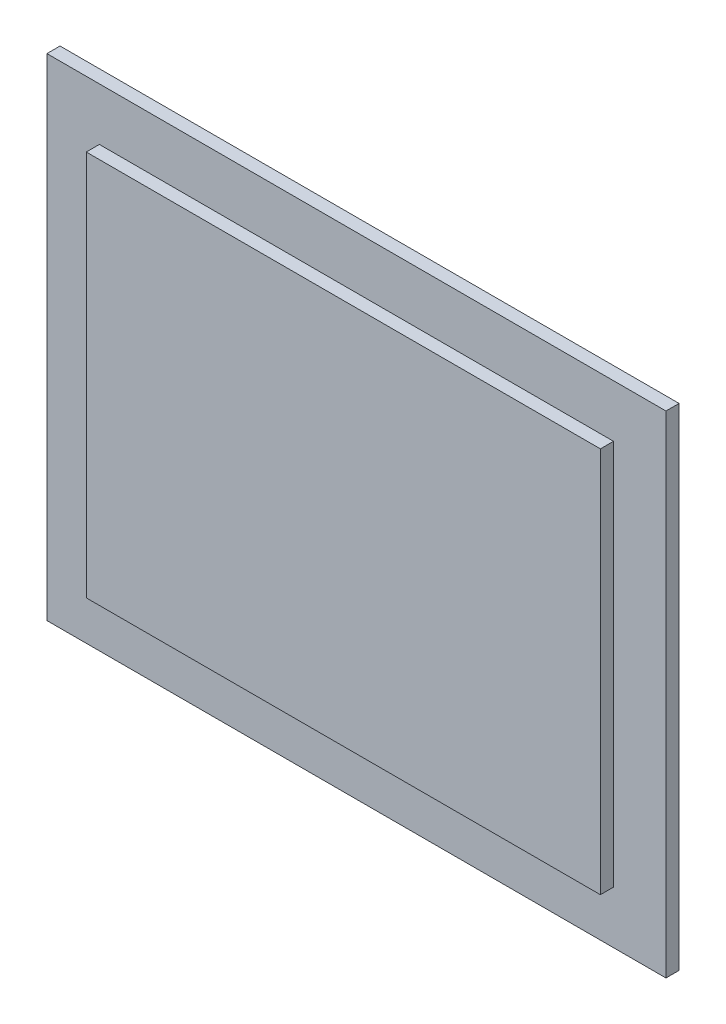
ISO-10303-21;
HEADER;
FILE_DESCRIPTION(('STEP AP214'),'2;1');
FILE_NAME('part.step','',(''),(''),'','','');
FILE_SCHEMA(('AUTOMOTIVE_DESIGN { 1 0 10303 214 1 1 1 1 }'));
ENDSEC;
DATA;
#1=APPLICATION_CONTEXT('core data for automotive mechanical design processes');
#2=APPLICATION_PROTOCOL_DEFINITION('international standard','automotive_design',2000,#1);
#3=PRODUCT_CONTEXT('',#1,'mechanical');
#4=PRODUCT('Part','Part','',(#3));
#5=PRODUCT_RELATED_PRODUCT_CATEGORY('part','',(#4));
#6=PRODUCT_DEFINITION_FORMATION('','',#4);
#7=PRODUCT_DEFINITION_CONTEXT('part definition',#1,'design');
#8=PRODUCT_DEFINITION('design','',#6,#7);
#9=PRODUCT_DEFINITION_SHAPE('','',#8);
#10=(LENGTH_UNIT() NAMED_UNIT(*) SI_UNIT(.MILLI.,.METRE.));
#11=(NAMED_UNIT(*) PLANE_ANGLE_UNIT() SI_UNIT($,.RADIAN.));
#12=(NAMED_UNIT(*) SI_UNIT($,.STERADIAN.) SOLID_ANGLE_UNIT());
#13=UNCERTAINTY_MEASURE_WITH_UNIT(LENGTH_MEASURE(1.E-05),#10,'distance_accuracy_value','');
#14=(GEOMETRIC_REPRESENTATION_CONTEXT(3) GLOBAL_UNCERTAINTY_ASSIGNED_CONTEXT((#13)) GLOBAL_UNIT_ASSIGNED_CONTEXT((#10,
#11,#12)) REPRESENTATION_CONTEXT('',''));
#15=CARTESIAN_POINT('',(0.,0.,0.));
#16=DIRECTION('',(0.,0.,1.));
#17=DIRECTION('',(1.,0.,0.));
#18=AXIS2_PLACEMENT_3D('',#15,#16,#17);
#19=CARTESIAN_POINT('',(0.,59.436,0.));
#20=DIRECTION('',(0.,0.,-1.));
#21=DIRECTION('',(-1.,0.,0.));
#22=AXIS2_PLACEMENT_3D('',#19,#20,#21);
#23=PLANE('',#22);
#24=DIRECTION('',(0.,-1.,0.));
#25=VECTOR('',#24,1.);
#26=CARTESIAN_POINT('',(0.,0.,0.));
#27=LINE('',#26,#25);
#28=CARTESIAN_POINT('',(0.,59.436,0.));
#29=VERTEX_POINT('',#28);
#30=CARTESIAN_POINT('',(0.,0.,0.));
#31=VERTEX_POINT('',#30);
#32=EDGE_CURVE('E118',#29,#31,#27,.T.);
#33=ORIENTED_EDGE('',*,*,#32,.T.);
#34=DIRECTION('',(1.,0.,0.));
#35=VECTOR('',#34,1.);
#36=CARTESIAN_POINT('',(0.,0.,0.));
#37=LINE('',#36,#35);
#38=CARTESIAN_POINT('',(74.93,0.,0.));
#39=VERTEX_POINT('',#38);
#40=EDGE_CURVE('E121',#31,#39,#37,.T.);
#41=ORIENTED_EDGE('',*,*,#40,.T.);
#42=DIRECTION('',(0.,1.,0.));
#43=VECTOR('',#42,1.);
#44=CARTESIAN_POINT('',(74.93,0.,0.));
#45=LINE('',#44,#43);
#46=CARTESIAN_POINT('',(74.93,59.436,0.));
#47=VERTEX_POINT('',#46);
#48=EDGE_CURVE('E142',#39,#47,#45,.T.);
#49=ORIENTED_EDGE('',*,*,#48,.T.);
#50=DIRECTION('',(-1.,0.,0.));
#51=VECTOR('',#50,1.);
#52=CARTESIAN_POINT('',(0.,59.436,0.));
#53=LINE('',#52,#51);
#54=EDGE_CURVE('E131',#47,#29,#53,.T.);
#55=ORIENTED_EDGE('',*,*,#54,.T.);
#56=EDGE_LOOP('',(#33,#41,#49,#55));
#57=FACE_BOUND('',#56,.T.);
#58=DIRECTION('',(0.,-1.,0.));
#59=VECTOR('',#58,1.);
#60=CARTESIAN_POINT('',(6.35,6.35,0.));
#61=LINE('',#60,#59);
#62=CARTESIAN_POINT('',(6.35,53.086,0.));
#63=VERTEX_POINT('',#62);
#64=CARTESIAN_POINT('',(6.35,6.35,0.));
#65=VERTEX_POINT('',#64);
#66=EDGE_CURVE('E117',#63,#65,#61,.T.);
#67=ORIENTED_EDGE('',*,*,#66,.F.);
#68=DIRECTION('',(-1.,0.,0.));
#69=VECTOR('',#68,1.);
#70=CARTESIAN_POINT('',(6.35,53.086,0.));
#71=LINE('',#70,#69);
#72=CARTESIAN_POINT('',(68.58,53.086,0.));
#73=VERTEX_POINT('',#72);
#74=EDGE_CURVE('E114',#73,#63,#71,.T.);
#75=ORIENTED_EDGE('',*,*,#74,.F.);
#76=DIRECTION('',(0.,1.,0.));
#77=VECTOR('',#76,1.);
#78=CARTESIAN_POINT('',(68.58,6.35,0.));
#79=LINE('',#78,#77);
#80=CARTESIAN_POINT('',(68.58,6.35,0.));
#81=VERTEX_POINT('',#80);
#82=EDGE_CURVE('E53',#81,#73,#79,.T.);
#83=ORIENTED_EDGE('',*,*,#82,.F.);
#84=DIRECTION('',(1.,0.,0.));
#85=VECTOR('',#84,1.);
#86=CARTESIAN_POINT('',(6.35,6.35,0.));
#87=LINE('',#86,#85);
#88=EDGE_CURVE('E48',#65,#81,#87,.T.);
#89=ORIENTED_EDGE('',*,*,#88,.F.);
#90=EDGE_LOOP('',(#67,#75,#83,#89));
#91=FACE_BOUND('',#90,.T.);
#92=ADVANCED_FACE('F31',(#57,#91),#23,.F.);
#93=CARTESIAN_POINT('',(0.,0.,-1.5875));
#94=DIRECTION('',(-1.,0.,0.));
#95=DIRECTION('',(0.,0.,1.));
#96=AXIS2_PLACEMENT_3D('',#93,#94,#95);
#97=PLANE('',#96);
#98=ORIENTED_EDGE('',*,*,#32,.F.);
#99=DIRECTION('',(0.,0.,1.));
#100=VECTOR('',#99,1.);
#101=CARTESIAN_POINT('',(0.,59.436,-1.5875));
#102=LINE('',#101,#100);
#103=CARTESIAN_POINT('',(0.,59.436,-1.5875));
#104=VERTEX_POINT('',#103);
#105=EDGE_CURVE('E11',#104,#29,#102,.T.);
#106=ORIENTED_EDGE('',*,*,#105,.F.);
#107=DIRECTION('',(0.,-1.,0.));
#108=VECTOR('',#107,1.);
#109=CARTESIAN_POINT('',(0.,0.,-1.5875));
#110=LINE('',#109,#108);
#111=CARTESIAN_POINT('',(0.,0.,-1.5875));
#112=VERTEX_POINT('',#111);
#113=EDGE_CURVE('E127',#104,#112,#110,.T.);
#114=ORIENTED_EDGE('',*,*,#113,.T.);
#115=DIRECTION('',(0.,0.,1.));
#116=VECTOR('',#115,1.);
#117=CARTESIAN_POINT('',(0.,0.,-1.5875));
#118=LINE('',#117,#116);
#119=EDGE_CURVE('E35',#112,#31,#118,.T.);
#120=ORIENTED_EDGE('',*,*,#119,.T.);
#121=EDGE_LOOP('',(#98,#106,#114,#120));
#122=FACE_BOUND('',#121,.T.);
#123=ADVANCED_FACE('F33',(#122),#97,.T.);
#124=CARTESIAN_POINT('',(0.,59.436,-1.5875));
#125=DIRECTION('',(0.,1.,0.));
#126=DIRECTION('',(0.,0.,1.));
#127=AXIS2_PLACEMENT_3D('',#124,#125,#126);
#128=PLANE('',#127);
#129=ORIENTED_EDGE('',*,*,#54,.F.);
#130=DIRECTION('',(0.,0.,1.));
#131=VECTOR('',#130,1.);
#132=CARTESIAN_POINT('',(74.93,59.436,-1.5875));
#133=LINE('',#132,#131);
#134=CARTESIAN_POINT('',(74.93,59.436,-1.5875));
#135=VERTEX_POINT('',#134);
#136=EDGE_CURVE('E40',#135,#47,#133,.T.);
#137=ORIENTED_EDGE('',*,*,#136,.F.);
#138=DIRECTION('',(-1.,0.,0.));
#139=VECTOR('',#138,1.);
#140=CARTESIAN_POINT('',(0.,59.436,-1.5875));
#141=LINE('',#140,#139);
#142=EDGE_CURVE('E137',#135,#104,#141,.T.);
#143=ORIENTED_EDGE('',*,*,#142,.T.);
#144=ORIENTED_EDGE('',*,*,#105,.T.);
#145=EDGE_LOOP('',(#129,#137,#143,#144));
#146=FACE_BOUND('',#145,.T.);
#147=ADVANCED_FACE('F159',(#146),#128,.T.);
#148=CARTESIAN_POINT('',(74.93,0.,-1.5875));
#149=DIRECTION('',(1.,0.,0.));
#150=DIRECTION('',(0.,0.,-1.));
#151=AXIS2_PLACEMENT_3D('',#148,#149,#150);
#152=PLANE('',#151);
#153=ORIENTED_EDGE('',*,*,#48,.F.);
#154=DIRECTION('',(0.,0.,1.));
#155=VECTOR('',#154,1.);
#156=CARTESIAN_POINT('',(74.93,0.,-1.5875));
#157=LINE('',#156,#155);
#158=CARTESIAN_POINT('',(74.93,0.,-1.5875));
#159=VERTEX_POINT('',#158);
#160=EDGE_CURVE('E147',#159,#39,#157,.T.);
#161=ORIENTED_EDGE('',*,*,#160,.F.);
#162=DIRECTION('',(0.,1.,0.));
#163=VECTOR('',#162,1.);
#164=CARTESIAN_POINT('',(74.93,0.,-1.5875));
#165=LINE('',#164,#163);
#166=EDGE_CURVE('E134',#159,#135,#165,.T.);
#167=ORIENTED_EDGE('',*,*,#166,.T.);
#168=ORIENTED_EDGE('',*,*,#136,.T.);
#169=EDGE_LOOP('',(#153,#161,#167,#168));
#170=FACE_BOUND('',#169,.T.);
#171=ADVANCED_FACE('F165',(#170),#152,.T.);
#172=CARTESIAN_POINT('',(0.,0.,-1.5875));
#173=DIRECTION('',(0.,-1.,0.));
#174=DIRECTION('',(0.,0.,-1.));
#175=AXIS2_PLACEMENT_3D('',#172,#173,#174);
#176=PLANE('',#175);
#177=ORIENTED_EDGE('',*,*,#40,.F.);
#178=ORIENTED_EDGE('',*,*,#119,.F.);
#179=DIRECTION('',(1.,0.,0.));
#180=VECTOR('',#179,1.);
#181=CARTESIAN_POINT('',(0.,0.,-1.5875));
#182=LINE('',#181,#180);
#183=EDGE_CURVE('E130',#112,#159,#182,.T.);
#184=ORIENTED_EDGE('',*,*,#183,.T.);
#185=ORIENTED_EDGE('',*,*,#160,.T.);
#186=EDGE_LOOP('',(#177,#178,#184,#185));
#187=FACE_BOUND('',#186,.T.);
#188=ADVANCED_FACE('F155',(#187),#176,.T.);
#189=CARTESIAN_POINT('',(0.,59.436,-1.5875));
#190=DIRECTION('',(0.,0.,-1.));
#191=DIRECTION('',(-1.,0.,0.));
#192=AXIS2_PLACEMENT_3D('',#189,#190,#191);
#193=PLANE('',#192);
#194=ORIENTED_EDGE('',*,*,#113,.F.);
#195=ORIENTED_EDGE('',*,*,#142,.F.);
#196=ORIENTED_EDGE('',*,*,#166,.F.);
#197=ORIENTED_EDGE('',*,*,#183,.F.);
#198=EDGE_LOOP('',(#194,#195,#196,#197));
#199=FACE_BOUND('',#198,.T.);
#200=ADVANCED_FACE('F162',(#199),#193,.T.);
#201=CARTESIAN_POINT('',(6.35,6.35,1.5875));
#202=DIRECTION('',(1.,0.,0.));
#203=DIRECTION('',(0.,0.,-1.));
#204=AXIS2_PLACEMENT_3D('',#201,#202,#203);
#205=PLANE('',#204);
#206=ORIENTED_EDGE('',*,*,#66,.T.);
#207=DIRECTION('',(0.,0.,-1.));
#208=VECTOR('',#207,1.);
#209=CARTESIAN_POINT('',(6.35,6.35,1.5875));
#210=LINE('',#209,#208);
#211=CARTESIAN_POINT('',(6.35,6.35,1.5875));
#212=VERTEX_POINT('',#211);
#213=EDGE_CURVE('E98',#212,#65,#210,.T.);
#214=ORIENTED_EDGE('',*,*,#213,.F.);
#215=DIRECTION('',(0.,-1.,0.));
#216=VECTOR('',#215,1.);
#217=CARTESIAN_POINT('',(6.35,6.35,1.5875));
#218=LINE('',#217,#216);
#219=CARTESIAN_POINT('',(6.35,53.086,1.5875));
#220=VERTEX_POINT('',#219);
#221=EDGE_CURVE('E105',#220,#212,#218,.T.);
#222=ORIENTED_EDGE('',*,*,#221,.F.);
#223=DIRECTION('',(0.,0.,-1.));
#224=VECTOR('',#223,1.);
#225=CARTESIAN_POINT('',(6.35,53.086,1.5875));
#226=LINE('',#225,#224);
#227=EDGE_CURVE('E258',#220,#63,#226,.T.);
#228=ORIENTED_EDGE('',*,*,#227,.T.);
#229=EDGE_LOOP('',(#206,#214,#222,#228));
#230=FACE_BOUND('',#229,.T.);
#231=ADVANCED_FACE('F116',(#230),#205,.F.);
#232=CARTESIAN_POINT('',(6.35,6.35,1.5875));
#233=DIRECTION('',(0.,1.,0.));
#234=DIRECTION('',(0.,0.,1.));
#235=AXIS2_PLACEMENT_3D('',#232,#233,#234);
#236=PLANE('',#235);
#237=ORIENTED_EDGE('',*,*,#88,.T.);
#238=DIRECTION('',(0.,0.,-1.));
#239=VECTOR('',#238,1.);
#240=CARTESIAN_POINT('',(68.58,6.35,1.5875));
#241=LINE('',#240,#239);
#242=CARTESIAN_POINT('',(68.58,6.35,1.5875));
#243=VERTEX_POINT('',#242);
#244=EDGE_CURVE('E101',#243,#81,#241,.T.);
#245=ORIENTED_EDGE('',*,*,#244,.F.);
#246=DIRECTION('',(1.,0.,0.));
#247=VECTOR('',#246,1.);
#248=CARTESIAN_POINT('',(6.35,6.35,1.5875));
#249=LINE('',#248,#247);
#250=EDGE_CURVE('E94',#212,#243,#249,.T.);
#251=ORIENTED_EDGE('',*,*,#250,.F.);
#252=ORIENTED_EDGE('',*,*,#213,.T.);
#253=EDGE_LOOP('',(#237,#245,#251,#252));
#254=FACE_BOUND('',#253,.T.);
#255=ADVANCED_FACE('F96',(#254),#236,.F.);
#256=CARTESIAN_POINT('',(68.58,6.35,1.5875));
#257=DIRECTION('',(-1.,0.,0.));
#258=DIRECTION('',(0.,0.,1.));
#259=AXIS2_PLACEMENT_3D('',#256,#257,#258);
#260=PLANE('',#259);
#261=ORIENTED_EDGE('',*,*,#82,.T.);
#262=DIRECTION('',(0.,0.,-1.));
#263=VECTOR('',#262,1.);
#264=CARTESIAN_POINT('',(68.58,53.086,1.5875));
#265=LINE('',#264,#263);
#266=CARTESIAN_POINT('',(68.58,53.086,1.5875));
#267=VERTEX_POINT('',#266);
#268=EDGE_CURVE('E123',#267,#73,#265,.T.);
#269=ORIENTED_EDGE('',*,*,#268,.F.);
#270=DIRECTION('',(0.,1.,0.));
#271=VECTOR('',#270,1.);
#272=CARTESIAN_POINT('',(68.58,6.35,1.5875));
#273=LINE('',#272,#271);
#274=EDGE_CURVE('E104',#243,#267,#273,.T.);
#275=ORIENTED_EDGE('',*,*,#274,.F.);
#276=ORIENTED_EDGE('',*,*,#244,.T.);
#277=EDGE_LOOP('',(#261,#269,#275,#276));
#278=FACE_BOUND('',#277,.T.);
#279=ADVANCED_FACE('F185',(#278),#260,.F.);
#280=CARTESIAN_POINT('',(6.35,53.086,1.5875));
#281=DIRECTION('',(0.,-1.,0.));
#282=DIRECTION('',(0.,0.,-1.));
#283=AXIS2_PLACEMENT_3D('',#280,#281,#282);
#284=PLANE('',#283);
#285=ORIENTED_EDGE('',*,*,#74,.T.);
#286=ORIENTED_EDGE('',*,*,#227,.F.);
#287=DIRECTION('',(-1.,0.,0.));
#288=VECTOR('',#287,1.);
#289=CARTESIAN_POINT('',(6.35,53.086,1.5875));
#290=LINE('',#289,#288);
#291=EDGE_CURVE('E110',#267,#220,#290,.T.);
#292=ORIENTED_EDGE('',*,*,#291,.F.);
#293=ORIENTED_EDGE('',*,*,#268,.T.);
#294=EDGE_LOOP('',(#285,#286,#292,#293));
#295=FACE_BOUND('',#294,.T.);
#296=ADVANCED_FACE('F188',(#295),#284,.F.);
#297=CARTESIAN_POINT('',(6.35,53.086,1.5875));
#298=DIRECTION('',(0.,0.,-1.));
#299=DIRECTION('',(-1.,0.,0.));
#300=AXIS2_PLACEMENT_3D('',#297,#298,#299);
#301=PLANE('',#300);
#302=ORIENTED_EDGE('',*,*,#221,.T.);
#303=ORIENTED_EDGE('',*,*,#250,.T.);
#304=ORIENTED_EDGE('',*,*,#274,.T.);
#305=ORIENTED_EDGE('',*,*,#291,.T.);
#306=EDGE_LOOP('',(#302,#303,#304,#305));
#307=FACE_BOUND('',#306,.T.);
#308=ADVANCED_FACE('F108',(#307),#301,.F.);
#309=CLOSED_SHELL('',(#92,#123,#147,#171,#188,#200,#231,#255,#279,#296,#308));
#310=MANIFOLD_SOLID_BREP('B2',#309);
#311=ADVANCED_BREP_SHAPE_REPRESENTATION('',(#18,#310),#14);
#312=SHAPE_DEFINITION_REPRESENTATION(#9,#311);
ENDSEC;
END-ISO-10303-21;
